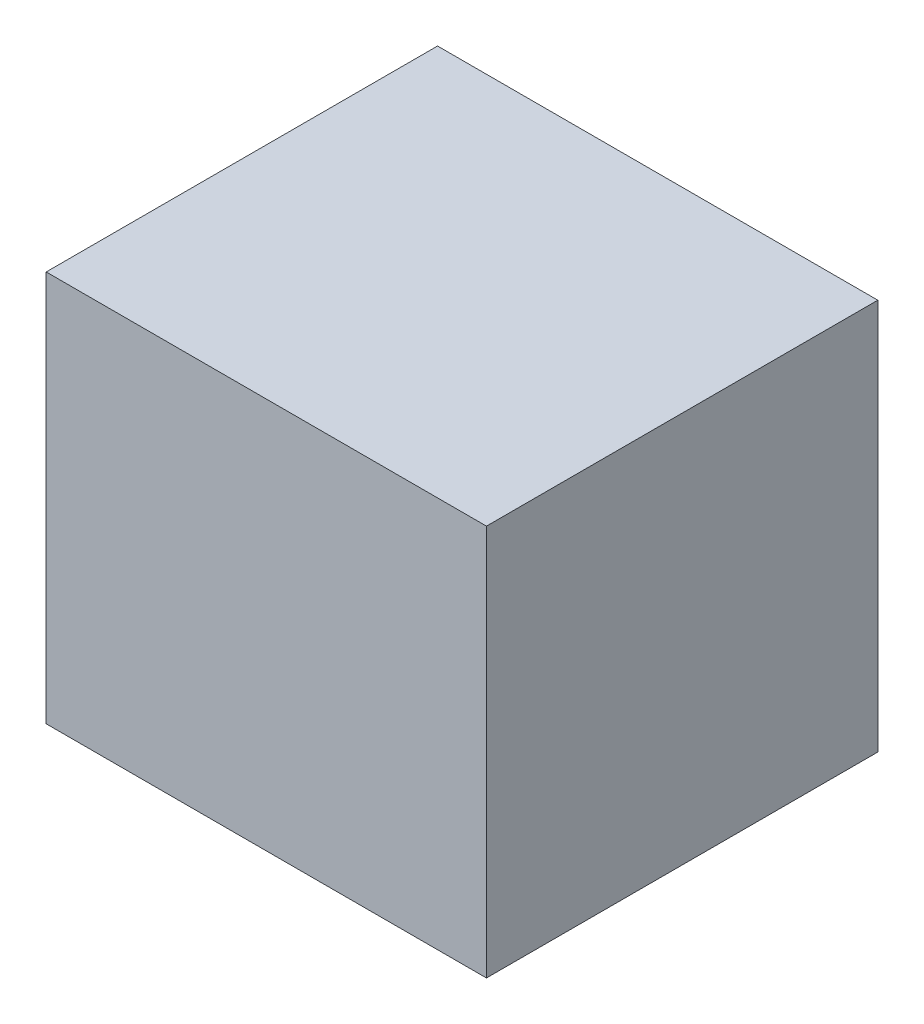
ISO-10303-21;
HEADER;
FILE_DESCRIPTION(('STEP AP214'),'2;1');
FILE_NAME('part.step','',(''),(''),'','','');
FILE_SCHEMA(('AUTOMOTIVE_DESIGN { 1 0 10303 214 1 1 1 1 }'));
ENDSEC;
DATA;
#1=APPLICATION_CONTEXT('core data for automotive mechanical design processes');
#2=APPLICATION_PROTOCOL_DEFINITION('international standard','automotive_design',2000,#1);
#3=PRODUCT_CONTEXT('',#1,'mechanical');
#4=PRODUCT('Part','Part','',(#3));
#5=PRODUCT_RELATED_PRODUCT_CATEGORY('part','',(#4));
#6=PRODUCT_DEFINITION_FORMATION('','',#4);
#7=PRODUCT_DEFINITION_CONTEXT('part definition',#1,'design');
#8=PRODUCT_DEFINITION('design','',#6,#7);
#9=PRODUCT_DEFINITION_SHAPE('','',#8);
#10=(LENGTH_UNIT() NAMED_UNIT(*) SI_UNIT(.MILLI.,.METRE.));
#11=(NAMED_UNIT(*) PLANE_ANGLE_UNIT() SI_UNIT($,.RADIAN.));
#12=(NAMED_UNIT(*) SI_UNIT($,.STERADIAN.) SOLID_ANGLE_UNIT());
#13=UNCERTAINTY_MEASURE_WITH_UNIT(LENGTH_MEASURE(1.E-05),#10,'distance_accuracy_value','');
#14=(GEOMETRIC_REPRESENTATION_CONTEXT(3) GLOBAL_UNCERTAINTY_ASSIGNED_CONTEXT((#13)) GLOBAL_UNIT_ASSIGNED_CONTEXT((#10,
#11,#12)) REPRESENTATION_CONTEXT('',''));
#15=CARTESIAN_POINT('',(0.,0.,0.));
#16=DIRECTION('',(0.,0.,1.));
#17=DIRECTION('',(1.,0.,0.));
#18=AXIS2_PLACEMENT_3D('',#15,#16,#17);
#19=CARTESIAN_POINT('',(0.,0.,50.8));
#20=DIRECTION('',(1.,0.,0.));
#21=DIRECTION('',(0.,0.,-1.));
#22=AXIS2_PLACEMENT_3D('',#19,#20,#21);
#23=PLANE('',#22);
#24=DIRECTION('',(0.,-1.,0.));
#25=VECTOR('',#24,1.);
#26=CARTESIAN_POINT('',(0.,0.,0.));
#27=LINE('',#26,#25);
#28=CARTESIAN_POINT('',(0.,50.8,0.));
#29=VERTEX_POINT('',#28);
#30=CARTESIAN_POINT('',(0.,0.,0.));
#31=VERTEX_POINT('',#30);
#32=EDGE_CURVE('E78',#29,#31,#27,.T.);
#33=ORIENTED_EDGE('',*,*,#32,.T.);
#34=DIRECTION('',(0.,0.,-1.));
#35=VECTOR('',#34,1.);
#36=CARTESIAN_POINT('',(0.,0.,50.8));
#37=LINE('',#36,#35);
#38=CARTESIAN_POINT('',(0.,0.,50.8));
#39=VERTEX_POINT('',#38);
#40=EDGE_CURVE('E12',#39,#31,#37,.T.);
#41=ORIENTED_EDGE('',*,*,#40,.F.);
#42=DIRECTION('',(0.,-1.,0.));
#43=VECTOR('',#42,1.);
#44=CARTESIAN_POINT('',(0.,0.,50.8));
#45=LINE('',#44,#43);
#46=CARTESIAN_POINT('',(0.,50.8,50.8));
#47=VERTEX_POINT('',#46);
#48=EDGE_CURVE('E96',#47,#39,#45,.T.);
#49=ORIENTED_EDGE('',*,*,#48,.F.);
#50=DIRECTION('',(0.,0.,-1.));
#51=VECTOR('',#50,1.);
#52=CARTESIAN_POINT('',(0.,50.8,50.8));
#53=LINE('',#52,#51);
#54=EDGE_CURVE('E90',#47,#29,#53,.T.);
#55=ORIENTED_EDGE('',*,*,#54,.T.);
#56=EDGE_LOOP('',(#33,#41,#49,#55));
#57=FACE_BOUND('',#56,.T.);
#58=ADVANCED_FACE('F34',(#57),#23,.F.);
#59=CARTESIAN_POINT('',(0.,0.,50.8));
#60=DIRECTION('',(0.,1.,0.));
#61=DIRECTION('',(0.,0.,1.));
#62=AXIS2_PLACEMENT_3D('',#59,#60,#61);
#63=PLANE('',#62);
#64=DIRECTION('',(1.,0.,0.));
#65=VECTOR('',#64,1.);
#66=CARTESIAN_POINT('',(0.,0.,0.));
#67=LINE('',#66,#65);
#68=CARTESIAN_POINT('',(57.15,0.,0.));
#69=VERTEX_POINT('',#68);
#70=EDGE_CURVE('E74',#31,#69,#67,.T.);
#71=ORIENTED_EDGE('',*,*,#70,.T.);
#72=DIRECTION('',(0.,0.,-1.));
#73=VECTOR('',#72,1.);
#74=CARTESIAN_POINT('',(57.15,0.,50.8));
#75=LINE('',#74,#73);
#76=CARTESIAN_POINT('',(57.15,0.,50.8));
#77=VERTEX_POINT('',#76);
#78=EDGE_CURVE('E41',#77,#69,#75,.T.);
#79=ORIENTED_EDGE('',*,*,#78,.F.);
#80=DIRECTION('',(1.,0.,0.));
#81=VECTOR('',#80,1.);
#82=CARTESIAN_POINT('',(0.,0.,50.8));
#83=LINE('',#82,#81);
#84=EDGE_CURVE('E86',#39,#77,#83,.T.);
#85=ORIENTED_EDGE('',*,*,#84,.F.);
#86=ORIENTED_EDGE('',*,*,#40,.T.);
#87=EDGE_LOOP('',(#71,#79,#85,#86));
#88=FACE_BOUND('',#87,.T.);
#89=ADVANCED_FACE('F85',(#88),#63,.F.);
#90=CARTESIAN_POINT('',(57.15,0.,50.8));
#91=DIRECTION('',(-1.,0.,0.));
#92=DIRECTION('',(0.,0.,1.));
#93=AXIS2_PLACEMENT_3D('',#90,#91,#92);
#94=PLANE('',#93);
#95=DIRECTION('',(0.,1.,0.));
#96=VECTOR('',#95,1.);
#97=CARTESIAN_POINT('',(57.15,0.,0.));
#98=LINE('',#97,#96);
#99=CARTESIAN_POINT('',(57.15,50.8,0.));
#100=VERTEX_POINT('',#99);
#101=EDGE_CURVE('E79',#69,#100,#98,.T.);
#102=ORIENTED_EDGE('',*,*,#101,.T.);
#103=DIRECTION('',(0.,0.,-1.));
#104=VECTOR('',#103,1.);
#105=CARTESIAN_POINT('',(57.15,50.8,50.8));
#106=LINE('',#105,#104);
#107=CARTESIAN_POINT('',(57.15,50.8,50.8));
#108=VERTEX_POINT('',#107);
#109=EDGE_CURVE('E102',#108,#100,#106,.T.);
#110=ORIENTED_EDGE('',*,*,#109,.F.);
#111=DIRECTION('',(0.,1.,0.));
#112=VECTOR('',#111,1.);
#113=CARTESIAN_POINT('',(57.15,0.,50.8));
#114=LINE('',#113,#112);
#115=EDGE_CURVE('E53',#77,#108,#114,.T.);
#116=ORIENTED_EDGE('',*,*,#115,.F.);
#117=ORIENTED_EDGE('',*,*,#78,.T.);
#118=EDGE_LOOP('',(#102,#110,#116,#117));
#119=FACE_BOUND('',#118,.T.);
#120=ADVANCED_FACE('F105',(#119),#94,.F.);
#121=CARTESIAN_POINT('',(0.,50.8,50.8));
#122=DIRECTION('',(0.,-1.,0.));
#123=DIRECTION('',(0.,0.,-1.));
#124=AXIS2_PLACEMENT_3D('',#121,#122,#123);
#125=PLANE('',#124);
#126=DIRECTION('',(-1.,0.,0.));
#127=VECTOR('',#126,1.);
#128=CARTESIAN_POINT('',(0.,50.8,0.));
#129=LINE('',#128,#127);
#130=EDGE_CURVE('E94',#100,#29,#129,.T.);
#131=ORIENTED_EDGE('',*,*,#130,.T.);
#132=ORIENTED_EDGE('',*,*,#54,.F.);
#133=DIRECTION('',(-1.,0.,0.));
#134=VECTOR('',#133,1.);
#135=CARTESIAN_POINT('',(0.,50.8,50.8));
#136=LINE('',#135,#134);
#137=EDGE_CURVE('E48',#108,#47,#136,.T.);
#138=ORIENTED_EDGE('',*,*,#137,.F.);
#139=ORIENTED_EDGE('',*,*,#109,.T.);
#140=EDGE_LOOP('',(#131,#132,#138,#139));
#141=FACE_BOUND('',#140,.T.);
#142=ADVANCED_FACE('F107',(#141),#125,.F.);
#143=CARTESIAN_POINT('',(0.,50.8,50.8));
#144=DIRECTION('',(0.,0.,-1.));
#145=DIRECTION('',(-1.,0.,0.));
#146=AXIS2_PLACEMENT_3D('',#143,#144,#145);
#147=PLANE('',#146);
#148=ORIENTED_EDGE('',*,*,#48,.T.);
#149=ORIENTED_EDGE('',*,*,#84,.T.);
#150=ORIENTED_EDGE('',*,*,#115,.T.);
#151=ORIENTED_EDGE('',*,*,#137,.T.);
#152=EDGE_LOOP('',(#148,#149,#150,#151));
#153=FACE_BOUND('',#152,.T.);
#154=ADVANCED_FACE('F108',(#153),#147,.F.);
#155=CARTESIAN_POINT('',(0.,50.8,0.));
#156=DIRECTION('',(0.,0.,-1.));
#157=DIRECTION('',(-1.,0.,0.));
#158=AXIS2_PLACEMENT_3D('',#155,#156,#157);
#159=PLANE('',#158);
#160=ORIENTED_EDGE('',*,*,#32,.F.);
#161=ORIENTED_EDGE('',*,*,#130,.F.);
#162=ORIENTED_EDGE('',*,*,#101,.F.);
#163=ORIENTED_EDGE('',*,*,#70,.F.);
#164=EDGE_LOOP('',(#160,#161,#162,#163));
#165=FACE_BOUND('',#164,.T.);
#166=ADVANCED_FACE('F75',(#165),#159,.T.);
#167=CLOSED_SHELL('',(#58,#89,#120,#142,#154,#166));
#168=MANIFOLD_SOLID_BREP('B2',#167);
#169=ADVANCED_BREP_SHAPE_REPRESENTATION('',(#18,#168),#14);
#170=SHAPE_DEFINITION_REPRESENTATION(#9,#169);
ENDSEC;
END-ISO-10303-21;
